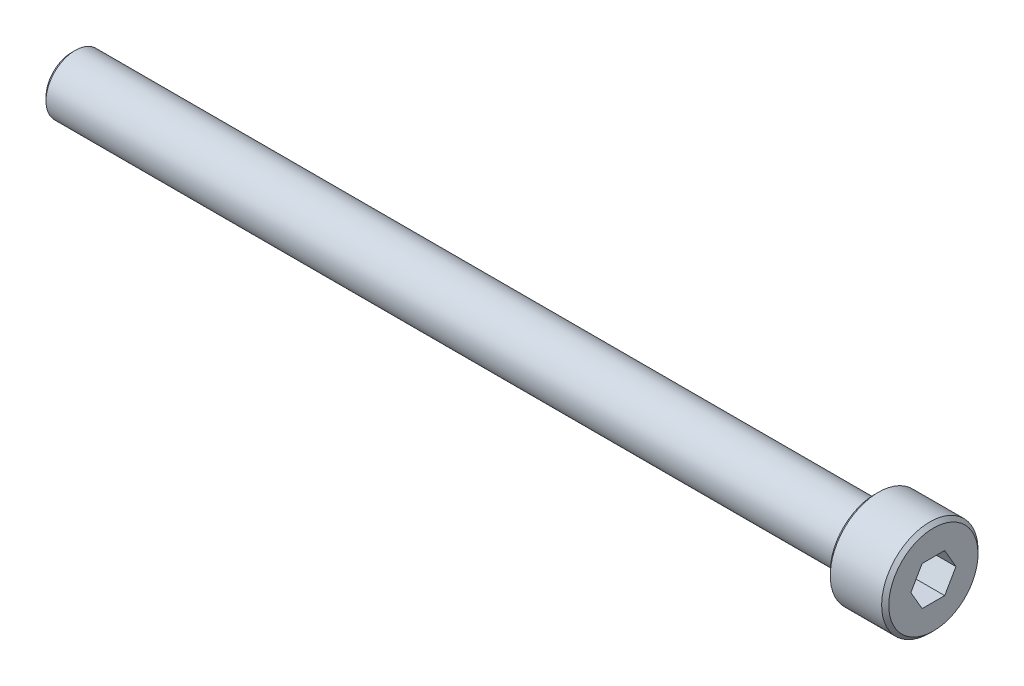
ISO-10303-21;
HEADER;
FILE_DESCRIPTION(('STEP AP214'),'2;1');
FILE_NAME('part.step','',(''),(''),'','','');
FILE_SCHEMA(('AUTOMOTIVE_DESIGN { 1 0 10303 214 1 1 1 1 }'));
ENDSEC;
DATA;
#1=APPLICATION_CONTEXT('core data for automotive mechanical design processes');
#2=APPLICATION_PROTOCOL_DEFINITION('international standard','automotive_design',2000,#1);
#3=PRODUCT_CONTEXT('',#1,'mechanical');
#4=PRODUCT('Part','Part','',(#3));
#5=PRODUCT_RELATED_PRODUCT_CATEGORY('part','',(#4));
#6=PRODUCT_DEFINITION_FORMATION('','',#4);
#7=PRODUCT_DEFINITION_CONTEXT('part definition',#1,'design');
#8=PRODUCT_DEFINITION('design','',#6,#7);
#9=PRODUCT_DEFINITION_SHAPE('','',#8);
#10=(LENGTH_UNIT() NAMED_UNIT(*) SI_UNIT(.MILLI.,.METRE.));
#11=(NAMED_UNIT(*) PLANE_ANGLE_UNIT() SI_UNIT($,.RADIAN.));
#12=(NAMED_UNIT(*) SI_UNIT($,.STERADIAN.) SOLID_ANGLE_UNIT());
#13=UNCERTAINTY_MEASURE_WITH_UNIT(LENGTH_MEASURE(1.E-05),#10,'distance_accuracy_value','');
#14=(GEOMETRIC_REPRESENTATION_CONTEXT(3) GLOBAL_UNCERTAINTY_ASSIGNED_CONTEXT((#13)) GLOBAL_UNIT_ASSIGNED_CONTEXT((#10,
#11,#12)) REPRESENTATION_CONTEXT('',''));
#15=CARTESIAN_POINT('',(0.,0.,0.));
#16=DIRECTION('',(0.,0.,1.));
#17=DIRECTION('',(1.,0.,0.));
#18=AXIS2_PLACEMENT_3D('',#15,#16,#17);
#19=CARTESIAN_POINT('',(58.7756000000015,-1.38906250000004,0.801975608297395));
#20=DIRECTION('',(0.,-1.,0.));
#21=DIRECTION('',(0.,0.,-1.));
#22=AXIS2_PLACEMENT_3D('',#19,#20,#21);
#23=PLANE('',#22);
#24=DIRECTION('',(1.,0.,0.));
#25=VECTOR('',#24,1.);
#26=CARTESIAN_POINT('',(58.7756000000014,-1.389062499999,-0.8019756082952));
#27=LINE('',#26,#25);
#28=CARTESIAN_POINT('',(61.3156000000014,-1.38906249999974,-0.801975608294974));
#29=VERTEX_POINT('',#28);
#30=CARTESIAN_POINT('',(58.7756000000015,-1.38906249999971,-0.801975608294869));
#31=VERTEX_POINT('',#30);
#32=EDGE_CURVE('E82',#29,#31,#27,.F.);
#33=ORIENTED_EDGE('',*,*,#32,.T.);
#34=DIRECTION('',(0.,0.,-1.));
#35=VECTOR('',#34,1.);
#36=CARTESIAN_POINT('',(58.7756000000015,-1.38906250000004,0.801975608297395));
#37=LINE('',#36,#35);
#38=CARTESIAN_POINT('',(58.7756000000015,-1.3890625000001,0.801975608297263));
#39=VERTEX_POINT('',#38);
#40=EDGE_CURVE('E71',#39,#31,#37,.T.);
#41=ORIENTED_EDGE('',*,*,#40,.F.);
#42=DIRECTION('',(1.,0.,0.));
#43=VECTOR('',#42,1.);
#44=CARTESIAN_POINT('',(58.7756000000015,-1.38906250000057,0.801975608298317));
#45=LINE('',#44,#43);
#46=CARTESIAN_POINT('',(61.3156000000015,-1.38906250000013,0.801975608297022));
#47=VERTEX_POINT('',#46);
#48=EDGE_CURVE('E90',#39,#47,#45,.T.);
#49=ORIENTED_EDGE('',*,*,#48,.T.);
#50=DIRECTION('',(0.,0.,-1.));
#51=VECTOR('',#50,1.);
#52=CARTESIAN_POINT('',(61.3156000000014,-1.38906250000004,0.801975608297395));
#53=LINE('',#52,#51);
#54=EDGE_CURVE('E66',#29,#47,#53,.F.);
#55=ORIENTED_EDGE('',*,*,#54,.F.);
#56=EDGE_LOOP('',(#33,#41,#49,#55));
#57=FACE_BOUND('',#56,.T.);
#58=ADVANCED_FACE('F16',(#57),#23,.F.);
#59=CARTESIAN_POINT('',(58.7756000000014,-1.38906249999976,-0.801975608294758));
#60=DIRECTION('',(0.,-0.5,-0.866025403784439));
#61=DIRECTION('',(0.,0.866025403784439,-0.5));
#62=AXIS2_PLACEMENT_3D('',#59,#60,#61);
#63=PLANE('',#62);
#64=DIRECTION('',(1.,0.,0.));
#65=VECTOR('',#64,1.);
#66=CARTESIAN_POINT('',(58.7756000000013,7.62545598470619E-13,-1.60395121659099));
#67=LINE('',#66,#65);
#68=CARTESIAN_POINT('',(61.3156000000014,6.6744299417473E-13,-1.60395121659115));
#69=VERTEX_POINT('',#68);
#70=CARTESIAN_POINT('',(58.7756000000014,5.14955967479931E-13,-1.6039512165911));
#71=VERTEX_POINT('',#70);
#72=EDGE_CURVE('E86',#69,#71,#67,.F.);
#73=ORIENTED_EDGE('',*,*,#72,.T.);
#74=DIRECTION('',(0.,0.866025403784439,-0.5));
#75=VECTOR('',#74,1.);
#76=CARTESIAN_POINT('',(58.7756000000014,-1.38906249999976,-0.801975608294758));
#77=LINE('',#76,#75);
#78=EDGE_CURVE('E75',#31,#71,#77,.T.);
#79=ORIENTED_EDGE('',*,*,#78,.F.);
#80=ORIENTED_EDGE('',*,*,#32,.F.);
#81=DIRECTION('',(0.,0.866025403784439,-0.5));
#82=VECTOR('',#81,1.);
#83=CARTESIAN_POINT('',(61.3156000000013,-1.38906249999976,-0.801975608294758));
#84=LINE('',#83,#82);
#85=EDGE_CURVE('E88',#69,#29,#84,.F.);
#86=ORIENTED_EDGE('',*,*,#85,.F.);
#87=EDGE_LOOP('',(#73,#79,#80,#86));
#88=FACE_BOUND('',#87,.T.);
#89=ADVANCED_FACE('F85',(#88),#63,.F.);
#90=CARTESIAN_POINT('',(58.7756000000015,4.9960036108132E-13,1.60395121659515));
#91=DIRECTION('',(0.,-0.500000000000001,0.866025403784438));
#92=DIRECTION('',(0.,-0.866025403784438,-0.500000000000001));
#93=AXIS2_PLACEMENT_3D('',#90,#91,#92);
#94=PLANE('',#93);
#95=ORIENTED_EDGE('',*,*,#48,.F.);
#96=DIRECTION('',(0.,0.866025403784106,0.500000000000576));
#97=VECTOR('',#96,1.);
#98=CARTESIAN_POINT('',(58.7756000000015,-1.38906250000004,0.801975608297395));
#99=LINE('',#98,#97);
#100=CARTESIAN_POINT('',(58.7756000000015,1.84591914815212E-13,1.60395121659497));
#101=VERTEX_POINT('',#100);
#102=EDGE_CURVE('E78',#39,#101,#99,.T.);
#103=ORIENTED_EDGE('',*,*,#102,.T.);
#104=DIRECTION('',(1.,0.,0.));
#105=VECTOR('',#104,1.);
#106=CARTESIAN_POINT('',(58.7756000000014,5.18682319317065E-13,1.60395121659518));
#107=LINE('',#106,#105);
#108=CARTESIAN_POINT('',(61.3156000000015,-1.76534808343964E-13,1.60395121659412));
#109=VERTEX_POINT('',#108);
#110=EDGE_CURVE('E124',#101,#109,#107,.T.);
#111=ORIENTED_EDGE('',*,*,#110,.T.);
#112=DIRECTION('',(0.,-0.866025403784438,-0.500000000000001));
#113=VECTOR('',#112,1.);
#114=CARTESIAN_POINT('',(61.3156000000015,4.99600361064206E-13,1.60395121659515));
#115=LINE('',#114,#113);
#116=EDGE_CURVE('E134',#47,#109,#115,.F.);
#117=ORIENTED_EDGE('',*,*,#116,.F.);
#118=EDGE_LOOP('',(#95,#103,#111,#117));
#119=FACE_BOUND('',#118,.T.);
#120=ADVANCED_FACE('F137',(#119),#94,.F.);
#121=CARTESIAN_POINT('',(58.7756000000013,3.88578058618805E-13,-1.60395121659121));
#122=DIRECTION('',(0.,0.500000000000001,-0.866025403784438));
#123=DIRECTION('',(0.,0.866025403784438,0.500000000000001));
#124=AXIS2_PLACEMENT_3D('',#121,#122,#123);
#125=PLANE('',#124);
#126=DIRECTION('',(-1.,0.,0.));
#127=VECTOR('',#126,1.);
#128=CARTESIAN_POINT('',(58.7756000000013,1.38906250000043,-0.801975608296202));
#129=LINE('',#128,#127);
#130=CARTESIAN_POINT('',(61.3156000000014,1.38906250000059,-0.801975608295595));
#131=VERTEX_POINT('',#130);
#132=CARTESIAN_POINT('',(58.7756000000014,1.38906250000055,-0.801975608295223));
#133=VERTEX_POINT('',#132);
#134=EDGE_CURVE('E120',#131,#133,#129,.T.);
#135=ORIENTED_EDGE('',*,*,#134,.T.);
#136=DIRECTION('',(0.,-0.866025403784455,-0.499999999999971));
#137=VECTOR('',#136,1.);
#138=CARTESIAN_POINT('',(58.7756000000015,1.38906250000043,-0.801975608295036));
#139=LINE('',#138,#137);
#140=EDGE_CURVE('E129',#133,#71,#139,.T.);
#141=ORIENTED_EDGE('',*,*,#140,.T.);
#142=ORIENTED_EDGE('',*,*,#72,.F.);
#143=DIRECTION('',(0.,0.866025403784438,0.500000000000001));
#144=VECTOR('',#143,1.);
#145=CARTESIAN_POINT('',(61.3156000000013,3.8857805860169E-13,-1.60395121659121));
#146=LINE('',#145,#144);
#147=EDGE_CURVE('E34',#131,#69,#146,.F.);
#148=ORIENTED_EDGE('',*,*,#147,.F.);
#149=EDGE_LOOP('',(#135,#141,#142,#148));
#150=FACE_BOUND('',#149,.T.);
#151=ADVANCED_FACE('F144',(#150),#125,.F.);
#152=CARTESIAN_POINT('',(58.7756000000015,-1.38906249999876,-2.40592682488597));
#153=DIRECTION('',(-1.,0.,0.));
#154=DIRECTION('',(0.,-1.,0.));
#155=AXIS2_PLACEMENT_3D('',#152,#153,#154);
#156=PLANE('',#155);
#157=DIRECTION('',(0.,0.,1.));
#158=VECTOR('',#157,1.);
#159=CARTESIAN_POINT('',(58.7756000000013,1.38906250000043,-0.801975608295036));
#160=LINE('',#159,#158);
#161=CARTESIAN_POINT('',(58.7756000000014,1.38906250000096,0.80197560829863));
#162=VERTEX_POINT('',#161);
#163=EDGE_CURVE('E118',#133,#162,#160,.T.);
#164=ORIENTED_EDGE('',*,*,#163,.T.);
#165=DIRECTION('',(0.,-0.866025403784438,0.500000000000001));
#166=VECTOR('',#165,1.);
#167=CARTESIAN_POINT('',(58.7756000000014,1.38906250000098,0.8019756082987));
#168=LINE('',#167,#166);
#169=EDGE_CURVE('E127',#162,#101,#168,.T.);
#170=ORIENTED_EDGE('',*,*,#169,.T.);
#171=ORIENTED_EDGE('',*,*,#102,.F.);
#172=ORIENTED_EDGE('',*,*,#40,.T.);
#173=ORIENTED_EDGE('',*,*,#78,.T.);
#174=ORIENTED_EDGE('',*,*,#140,.F.);
#175=EDGE_LOOP('',(#164,#170,#171,#172,#173,#174));
#176=FACE_BOUND('',#175,.T.);
#177=ADVANCED_FACE('F72',(#176),#156,.F.);
#178=CARTESIAN_POINT('',(58.7756000000014,1.38906250000098,0.8019756082987));
#179=DIRECTION('',(0.,0.500000000000001,0.866025403784438));
#180=DIRECTION('',(0.,-0.866025403784438,0.500000000000001));
#181=AXIS2_PLACEMENT_3D('',#178,#179,#180);
#182=PLANE('',#181);
#183=ORIENTED_EDGE('',*,*,#110,.F.);
#184=ORIENTED_EDGE('',*,*,#169,.F.);
#185=DIRECTION('',(-1.,0.,0.));
#186=VECTOR('',#185,1.);
#187=CARTESIAN_POINT('',(58.7756000000013,1.38906250000043,0.8019756082987));
#188=LINE('',#187,#186);
#189=CARTESIAN_POINT('',(61.3156000000015,1.38906250000113,0.801975608298416));
#190=VERTEX_POINT('',#189);
#191=EDGE_CURVE('E115',#162,#190,#188,.F.);
#192=ORIENTED_EDGE('',*,*,#191,.T.);
#193=DIRECTION('',(0.,-0.866025403784438,0.500000000000001));
#194=VECTOR('',#193,1.);
#195=CARTESIAN_POINT('',(61.3156000000015,1.38906250000098,0.8019756082987));
#196=LINE('',#195,#194);
#197=EDGE_CURVE('E122',#109,#190,#196,.F.);
#198=ORIENTED_EDGE('',*,*,#197,.F.);
#199=EDGE_LOOP('',(#183,#184,#192,#198));
#200=FACE_BOUND('',#199,.T.);
#201=ADVANCED_FACE('F151',(#200),#182,.F.);
#202=CARTESIAN_POINT('',(58.7756000000013,1.38906250000043,-0.801975608295036));
#203=DIRECTION('',(0.,1.,0.));
#204=DIRECTION('',(-1.,0.,0.));
#205=AXIS2_PLACEMENT_3D('',#202,#203,#204);
#206=PLANE('',#205);
#207=ORIENTED_EDGE('',*,*,#191,.F.);
#208=ORIENTED_EDGE('',*,*,#163,.F.);
#209=ORIENTED_EDGE('',*,*,#134,.F.);
#210=DIRECTION('',(0.,0.,1.));
#211=VECTOR('',#210,1.);
#212=CARTESIAN_POINT('',(61.3156000000016,1.38906250000115,3.88578058618805E-13));
#213=LINE('',#212,#211);
#214=EDGE_CURVE('E112',#131,#190,#213,.T.);
#215=ORIENTED_EDGE('',*,*,#214,.T.);
#216=EDGE_LOOP('',(#207,#208,#209,#215));
#217=FACE_BOUND('',#216,.T.);
#218=ADVANCED_FACE('F149',(#217),#206,.F.);
#219=CARTESIAN_POINT('',(61.3156000000016,3.42900000000057,3.88578058618805E-13));
#220=DIRECTION('',(-1.,0.,0.));
#221=DIRECTION('',(0.,-1.,0.));
#222=AXIS2_PLACEMENT_3D('',#219,#220,#221);
#223=PLANE('',#222);
#224=ORIENTED_EDGE('',*,*,#147,.T.);
#225=ORIENTED_EDGE('',*,*,#85,.T.);
#226=ORIENTED_EDGE('',*,*,#54,.T.);
#227=ORIENTED_EDGE('',*,*,#116,.T.);
#228=ORIENTED_EDGE('',*,*,#197,.T.);
#229=ORIENTED_EDGE('',*,*,#214,.F.);
#230=EDGE_LOOP('',(#224,#225,#226,#227,#228,#229));
#231=FACE_BOUND('',#230,.T.);
#232=CARTESIAN_POINT('',(61.3156000000004,9.99457718233084E-13,6.66133814775094E-13));
#233=DIRECTION('',(-1.,0.,0.));
#234=DIRECTION('',(0.,-1.,0.));
#235=AXIS2_PLACEMENT_3D('',#232,#233,#234);
#236=CIRCLE('',#235,3.17500000005499);
#237=CARTESIAN_POINT('',(61.3156000000004,-3.175000000054,6.66133814775094E-13));
#238=VERTEX_POINT('',#237);
#239=EDGE_CURVE('E19',#238,#238,#236,.T.);
#240=ORIENTED_EDGE('',*,*,#239,.F.);
#241=EDGE_LOOP('',(#240));
#242=FACE_BOUND('',#241,.T.);
#243=ADVANCED_FACE('F141',(#231,#242),#223,.F.);
#244=CARTESIAN_POINT('',(61.0616000000732,9.99200722162641E-13,6.66133814775094E-13));
#245=DIRECTION('',(-1.,0.,0.));
#246=DIRECTION('',(0.,-1.,0.));
#247=AXIS2_PLACEMENT_3D('',#244,#245,#246);
#248=CONICAL_SURFACE('',#247,3.42899999998214,0.785398163397448);
#249=ORIENTED_EDGE('',*,*,#239,.T.);
#250=EDGE_LOOP('',(#249));
#251=FACE_BOUND('',#250,.T.);
#252=CARTESIAN_POINT('',(61.0616000000014,0.,2.4980018008335E-13));
#253=DIRECTION('',(-1.,0.,0.));
#254=DIRECTION('',(0.,-1.,0.));
#255=AXIS2_PLACEMENT_3D('',#252,#253,#254);
#256=CIRCLE('',#255,3.429);
#257=CARTESIAN_POINT('',(61.0616000000014,-3.42900000000005,2.4980018008335E-13));
#258=VERTEX_POINT('',#257);
#259=EDGE_CURVE('E105',#258,#258,#256,.T.);
#260=ORIENTED_EDGE('',*,*,#259,.F.);
#261=EDGE_LOOP('',(#260));
#262=FACE_BOUND('',#261,.T.);
#263=ADVANCED_FACE('F187',(#251,#262),#248,.T.);
#264=CARTESIAN_POINT('',(0.,0.,2.4980018054066E-13));
#265=DIRECTION('',(-1.,0.,0.));
#266=DIRECTION('',(0.,-1.,0.));
#267=AXIS2_PLACEMENT_3D('',#264,#265,#266);
#268=CYLINDRICAL_SURFACE('',#267,3.429);
#269=ORIENTED_EDGE('',*,*,#259,.T.);
#270=EDGE_LOOP('',(#269));
#271=FACE_BOUND('',#270,.T.);
#272=CARTESIAN_POINT('',(57.4040000000196,1.66533453697325E-13,8.88178419698223E-13));
#273=DIRECTION('',(1.,0.,0.));
#274=DIRECTION('',(0.,0.,-1.));
#275=AXIS2_PLACEMENT_3D('',#272,#273,#274);
#276=CIRCLE('',#275,3.42900000004054);
#277=CARTESIAN_POINT('',(57.4040000000196,1.66533453697325E-13,-3.42900000003965));
#278=VERTEX_POINT('',#277);
#279=EDGE_CURVE('E101',#278,#278,#276,.F.);
#280=ORIENTED_EDGE('',*,*,#279,.F.);
#281=EDGE_LOOP('',(#280));
#282=FACE_BOUND('',#281,.T.);
#283=ADVANCED_FACE('F184',(#271,#282),#268,.T.);
#284=CARTESIAN_POINT('',(57.4040000000764,1.66533453697325E-13,8.88178419700125E-13));
#285=DIRECTION('',(1.,0.,0.));
#286=DIRECTION('',(0.,0.,-1.));
#287=AXIS2_PLACEMENT_3D('',#284,#285,#286);
#288=CONICAL_SURFACE('',#287,3.42900000009738,0.785398163397448);
#289=CARTESIAN_POINT('',(57.1500000000356,1.66533453697325E-13,8.88178419700125E-13));
#290=DIRECTION('',(1.,0.,0.));
#291=DIRECTION('',(0.,0.,-1.));
#292=AXIS2_PLACEMENT_3D('',#289,#290,#291);
#293=CIRCLE('',#292,3.17500000005655);
#294=CARTESIAN_POINT('',(57.1500000000356,1.66533453697325E-13,-3.17500000005566));
#295=VERTEX_POINT('',#294);
#296=EDGE_CURVE('E99',#295,#295,#293,.T.);
#297=ORIENTED_EDGE('',*,*,#296,.T.);
#298=EDGE_LOOP('',(#297));
#299=FACE_BOUND('',#298,.T.);
#300=ORIENTED_EDGE('',*,*,#279,.T.);
#301=EDGE_LOOP('',(#300));
#302=FACE_BOUND('',#301,.T.);
#303=ADVANCED_FACE('F180',(#299,#302),#288,.T.);
#304=CARTESIAN_POINT('',(0.,0.,2.4980018054066E-13));
#305=DIRECTION('',(1.,0.,0.));
#306=DIRECTION('',(0.,1.,0.));
#307=AXIS2_PLACEMENT_3D('',#304,#305,#306);
#308=PLANE('',#307);
#309=CARTESIAN_POINT('',(0.,0.,2.4980018054066E-13));
#310=DIRECTION('',(1.,0.,0.));
#311=DIRECTION('',(0.,0.,-1.));
#312=AXIS2_PLACEMENT_3D('',#309,#310,#311);
#313=CIRCLE('',#312,1.82879999999866);
#314=CARTESIAN_POINT('',(0.,0.,-1.82879999999841));
#315=VERTEX_POINT('',#314);
#316=EDGE_CURVE('E97',#315,#315,#313,.T.);
#317=ORIENTED_EDGE('',*,*,#316,.F.);
#318=EDGE_LOOP('',(#317));
#319=FACE_BOUND('',#318,.T.);
#320=ADVANCED_FACE('F176',(#319),#308,.F.);
#321=CARTESIAN_POINT('',(57.1500000000013,2.08280000000127,2.692290834716E-12));
#322=DIRECTION('',(1.,0.,0.));
#323=DIRECTION('',(0.,1.,0.));
#324=AXIS2_PLACEMENT_3D('',#321,#322,#323);
#325=PLANE('',#324);
#326=CARTESIAN_POINT('',(57.1500000000014,0.,2.49800180112645E-13));
#327=DIRECTION('',(-1.,0.,0.));
#328=DIRECTION('',(0.,-1.,0.));
#329=AXIS2_PLACEMENT_3D('',#326,#327,#328);
#330=CIRCLE('',#329,2.0828);
#331=CARTESIAN_POINT('',(57.1500000000014,-2.08280000000005,2.49800180112645E-13));
#332=VERTEX_POINT('',#331);
#333=EDGE_CURVE('E25',#332,#332,#330,.T.);
#334=ORIENTED_EDGE('',*,*,#333,.F.);
#335=EDGE_LOOP('',(#334));
#336=FACE_BOUND('',#335,.T.);
#337=ORIENTED_EDGE('',*,*,#296,.F.);
#338=EDGE_LOOP('',(#337));
#339=FACE_BOUND('',#338,.T.);
#340=ADVANCED_FACE('F169',(#336,#339),#325,.F.);
#341=CARTESIAN_POINT('',(0.253999999927146,0.,2.4980018054066E-13));
#342=DIRECTION('',(1.,0.,0.));
#343=DIRECTION('',(0.,0.,-1.));
#344=AXIS2_PLACEMENT_3D('',#341,#342,#343);
#345=CONICAL_SURFACE('',#344,2.0827999999258,0.785398163397448);
#346=CARTESIAN_POINT('',(0.254000000000025,0.,2.49800180538758E-13));
#347=DIRECTION('',(-1.,0.,0.));
#348=DIRECTION('',(0.,-1.,0.));
#349=AXIS2_PLACEMENT_3D('',#346,#347,#348);
#350=CIRCLE('',#349,2.0828);
#351=CARTESIAN_POINT('',(0.254000000000025,-2.08280000000005,2.49800180538758E-13));
#352=VERTEX_POINT('',#351);
#353=EDGE_CURVE('E11',#352,#352,#350,.F.);
#354=ORIENTED_EDGE('',*,*,#353,.F.);
#355=EDGE_LOOP('',(#354));
#356=FACE_BOUND('',#355,.T.);
#357=ORIENTED_EDGE('',*,*,#316,.T.);
#358=EDGE_LOOP('',(#357));
#359=FACE_BOUND('',#358,.T.);
#360=ADVANCED_FACE('F163',(#356,#359),#345,.T.);
#361=CARTESIAN_POINT('',(0.,0.,2.4980018054066E-13));
#362=DIRECTION('',(-1.,0.,0.));
#363=DIRECTION('',(0.,-1.,0.));
#364=AXIS2_PLACEMENT_3D('',#361,#362,#363);
#365=CYLINDRICAL_SURFACE('',#364,2.0828);
#366=ORIENTED_EDGE('',*,*,#333,.T.);
#367=EDGE_LOOP('',(#366));
#368=FACE_BOUND('',#367,.T.);
#369=ORIENTED_EDGE('',*,*,#353,.T.);
#370=EDGE_LOOP('',(#369));
#371=FACE_BOUND('',#370,.T.);
#372=ADVANCED_FACE('F161',(#368,#371),#365,.T.);
#373=CLOSED_SHELL('',(#58,#89,#120,#151,#177,#201,#218,#243,#263,#283,#303,#320,#340,#360,#372));
#374=MANIFOLD_SOLID_BREP('B1',#373);
#375=ADVANCED_BREP_SHAPE_REPRESENTATION('',(#18,#374),#14);
#376=SHAPE_DEFINITION_REPRESENTATION(#9,#375);
ENDSEC;
END-ISO-10303-21;
